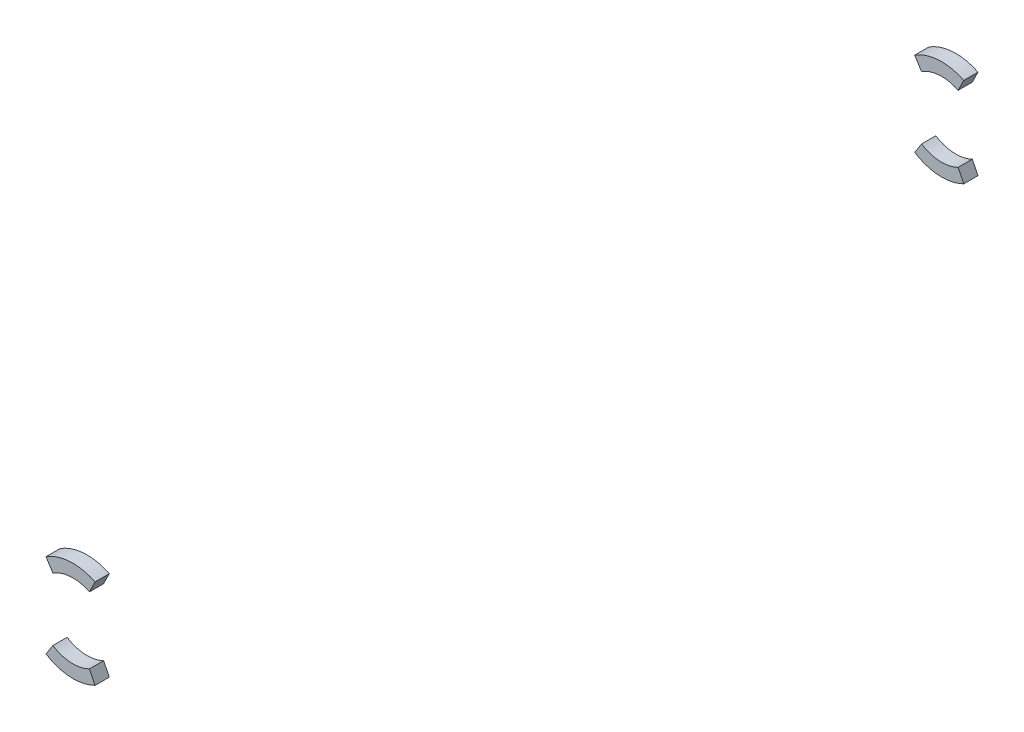
ISO-10303-21;
HEADER;
FILE_DESCRIPTION(('STEP AP214'),'2;1');
FILE_NAME('part.step','',(''),(''),'','','');
FILE_SCHEMA(('AUTOMOTIVE_DESIGN { 1 0 10303 214 1 1 1 1 }'));
ENDSEC;
DATA;
#1=APPLICATION_CONTEXT('core data for automotive mechanical design processes');
#2=APPLICATION_PROTOCOL_DEFINITION('international standard','automotive_design',2000,#1);
#3=PRODUCT_CONTEXT('',#1,'mechanical');
#4=PRODUCT('Part','Part','',(#3));
#5=PRODUCT_RELATED_PRODUCT_CATEGORY('part','',(#4));
#6=PRODUCT_DEFINITION_FORMATION('','',#4);
#7=PRODUCT_DEFINITION_CONTEXT('part definition',#1,'design');
#8=PRODUCT_DEFINITION('design','',#6,#7);
#9=PRODUCT_DEFINITION_SHAPE('','',#8);
#10=(LENGTH_UNIT() NAMED_UNIT(*) SI_UNIT(.MILLI.,.METRE.));
#11=(NAMED_UNIT(*) PLANE_ANGLE_UNIT() SI_UNIT($,.RADIAN.));
#12=(NAMED_UNIT(*) SI_UNIT($,.STERADIAN.) SOLID_ANGLE_UNIT());
#13=UNCERTAINTY_MEASURE_WITH_UNIT(LENGTH_MEASURE(1.E-05),#10,'distance_accuracy_value','');
#14=(GEOMETRIC_REPRESENTATION_CONTEXT(3) GLOBAL_UNCERTAINTY_ASSIGNED_CONTEXT((#13)) GLOBAL_UNIT_ASSIGNED_CONTEXT((#10,
#11,#12)) REPRESENTATION_CONTEXT('',''));
#15=CARTESIAN_POINT('',(0.,0.,0.));
#16=DIRECTION('',(0.,0.,1.));
#17=DIRECTION('',(1.,0.,0.));
#18=AXIS2_PLACEMENT_3D('',#15,#16,#17);
#19=CARTESIAN_POINT('',(0.,0.,1200.));
#20=DIRECTION('',(0.,0.,1.));
#21=DIRECTION('',(1.,0.,0.));
#22=AXIS2_PLACEMENT_3D('',#19,#20,#21);
#23=CYLINDRICAL_SURFACE('',#22,70.1988909444927);
#24=CARTESIAN_POINT('',(0.,0.,1220.));
#25=DIRECTION('',(0.,0.,1.));
#26=DIRECTION('',(1.,0.,0.));
#27=AXIS2_PLACEMENT_3D('',#24,#25,#26);
#28=CIRCLE('',#27,70.1988909444927);
#29=CARTESIAN_POINT('',(-37.8214558862849,-59.1390037494595,1220.));
#30=VERTEX_POINT('',#29);
#31=CARTESIAN_POINT('',(31.1075264082809,-62.9301683661731,1220.));
#32=VERTEX_POINT('',#31);
#33=EDGE_CURVE('E114',#30,#32,#28,.T.);
#34=ORIENTED_EDGE('',*,*,#33,.F.);
#35=DIRECTION('',(0.,0.,1.));
#36=VECTOR('',#35,1.);
#37=CARTESIAN_POINT('',(-37.8214558862849,-59.1390037494595,1200.));
#38=LINE('',#37,#36);
#39=CARTESIAN_POINT('',(-37.8214558862849,-59.1390037494595,1200.));
#40=VERTEX_POINT('',#39);
#41=EDGE_CURVE('E12',#40,#30,#38,.T.);
#42=ORIENTED_EDGE('',*,*,#41,.F.);
#43=CARTESIAN_POINT('',(0.,0.,1200.));
#44=DIRECTION('',(0.,0.,1.));
#45=DIRECTION('',(1.,0.,0.));
#46=AXIS2_PLACEMENT_3D('',#43,#44,#45);
#47=CIRCLE('',#46,70.1988909444927);
#48=CARTESIAN_POINT('',(31.1075264082809,-62.9301683661731,1200.));
#49=VERTEX_POINT('',#48);
#50=EDGE_CURVE('E108',#40,#49,#47,.T.);
#51=ORIENTED_EDGE('',*,*,#50,.T.);
#52=DIRECTION('',(0.,0.,1.));
#53=VECTOR('',#52,1.);
#54=CARTESIAN_POINT('',(31.1075264082809,-62.9301683661731,1200.));
#55=LINE('',#54,#53);
#56=EDGE_CURVE('E53',#49,#32,#55,.T.);
#57=ORIENTED_EDGE('',*,*,#56,.T.);
#58=EDGE_LOOP('',(#34,#42,#51,#57));
#59=FACE_BOUND('',#58,.T.);
#60=ADVANCED_FACE('F50',(#59),#23,.T.);
#61=CARTESIAN_POINT('',(-37.8214558862849,-59.1390037494595,1200.));
#62=DIRECTION('',(-0.842449260291328,0.538775689721237,0.));
#63=DIRECTION('',(-0.538775689721237,-0.842449260291328,0.));
#64=AXIS2_PLACEMENT_3D('',#61,#62,#63);
#65=PLANE('',#64);
#66=DIRECTION('',(-0.538775689721237,-0.842449260291328,0.));
#67=VECTOR('',#66,1.);
#68=CARTESIAN_POINT('',(-37.8214558862849,-59.1390037494595,1220.));
#69=LINE('',#68,#67);
#70=CARTESIAN_POINT('',(-28.1601263047385,-44.0321974946789,1220.));
#71=VERTEX_POINT('',#70);
#72=EDGE_CURVE('E110',#71,#30,#69,.T.);
#73=ORIENTED_EDGE('',*,*,#72,.F.);
#74=DIRECTION('',(0.,0.,1.));
#75=VECTOR('',#74,1.);
#76=CARTESIAN_POINT('',(-28.1601263047385,-44.0321974946789,1200.));
#77=LINE('',#76,#75);
#78=CARTESIAN_POINT('',(-28.1601263047385,-44.0321974946789,1200.));
#79=VERTEX_POINT('',#78);
#80=EDGE_CURVE('E59',#79,#71,#77,.T.);
#81=ORIENTED_EDGE('',*,*,#80,.F.);
#82=DIRECTION('',(-0.538775689721237,-0.842449260291328,0.));
#83=VECTOR('',#82,1.);
#84=CARTESIAN_POINT('',(-37.8214558862849,-59.1390037494595,1200.));
#85=LINE('',#84,#83);
#86=EDGE_CURVE('E105',#79,#40,#85,.T.);
#87=ORIENTED_EDGE('',*,*,#86,.T.);
#88=ORIENTED_EDGE('',*,*,#41,.T.);
#89=EDGE_LOOP('',(#73,#81,#87,#88));
#90=FACE_BOUND('',#89,.T.);
#91=ADVANCED_FACE('F124',(#90),#65,.T.);
#92=CARTESIAN_POINT('',(0.,0.,1200.));
#93=DIRECTION('',(0.,0.,1.));
#94=DIRECTION('',(1.,0.,0.));
#95=AXIS2_PLACEMENT_3D('',#92,#93,#94);
#96=CYLINDRICAL_SURFACE('',#95,52.2668836808665);
#97=CARTESIAN_POINT('',(0.,0.,1220.));
#98=DIRECTION('',(0.,0.,-1.));
#99=DIRECTION('',(1.,0.,0.));
#100=AXIS2_PLACEMENT_3D('',#97,#98,#99);
#101=CIRCLE('',#100,52.2668836808665);
#102=CARTESIAN_POINT('',(23.1612414741241,-46.8549252809834,1220.));
#103=VERTEX_POINT('',#102);
#104=EDGE_CURVE('E100',#103,#71,#101,.T.);
#105=ORIENTED_EDGE('',*,*,#104,.F.);
#106=DIRECTION('',(0.,0.,1.));
#107=VECTOR('',#106,1.);
#108=CARTESIAN_POINT('',(23.1612414741241,-46.8549252809834,1200.));
#109=LINE('',#108,#107);
#110=CARTESIAN_POINT('',(23.1612414741241,-46.8549252809834,1200.));
#111=VERTEX_POINT('',#110);
#112=EDGE_CURVE('E95',#111,#103,#109,.T.);
#113=ORIENTED_EDGE('',*,*,#112,.F.);
#114=CARTESIAN_POINT('',(0.,0.,1200.));
#115=DIRECTION('',(0.,0.,-1.));
#116=DIRECTION('',(1.,0.,0.));
#117=AXIS2_PLACEMENT_3D('',#114,#115,#116);
#118=CIRCLE('',#117,52.2668836808665);
#119=EDGE_CURVE('E98',#111,#79,#118,.T.);
#120=ORIENTED_EDGE('',*,*,#119,.T.);
#121=ORIENTED_EDGE('',*,*,#80,.T.);
#122=EDGE_LOOP('',(#105,#113,#120,#121));
#123=FACE_BOUND('',#122,.T.);
#124=ADVANCED_FACE('F97',(#123),#96,.F.);
#125=CARTESIAN_POINT('',(31.1075264082809,-62.9301683661731,1200.));
#126=DIRECTION('',(0.896455307476764,0.443134157673204,0.));
#127=DIRECTION('',(-0.443134157673204,0.896455307476764,0.));
#128=AXIS2_PLACEMENT_3D('',#125,#126,#127);
#129=PLANE('',#128);
#130=DIRECTION('',(-0.443134157673204,0.896455307476764,0.));
#131=VECTOR('',#130,1.);
#132=CARTESIAN_POINT('',(31.1075264082809,-62.9301683661731,1220.));
#133=LINE('',#132,#131);
#134=EDGE_CURVE('E117',#32,#103,#133,.T.);
#135=ORIENTED_EDGE('',*,*,#134,.F.);
#136=ORIENTED_EDGE('',*,*,#56,.F.);
#137=DIRECTION('',(-0.443134157673204,0.896455307476764,0.));
#138=VECTOR('',#137,1.);
#139=CARTESIAN_POINT('',(31.1075264082809,-62.9301683661731,1200.));
#140=LINE('',#139,#138);
#141=EDGE_CURVE('E104',#49,#111,#140,.T.);
#142=ORIENTED_EDGE('',*,*,#141,.T.);
#143=ORIENTED_EDGE('',*,*,#112,.T.);
#144=EDGE_LOOP('',(#135,#136,#142,#143));
#145=FACE_BOUND('',#144,.T.);
#146=ADVANCED_FACE('F107',(#145),#129,.T.);
#147=CARTESIAN_POINT('',(0.,0.,1200.));
#148=DIRECTION('',(0.,0.,1.));
#149=DIRECTION('',(1.,0.,0.));
#150=AXIS2_PLACEMENT_3D('',#147,#148,#149);
#151=PLANE('',#150);
#152=ORIENTED_EDGE('',*,*,#50,.F.);
#153=ORIENTED_EDGE('',*,*,#86,.F.);
#154=ORIENTED_EDGE('',*,*,#119,.F.);
#155=ORIENTED_EDGE('',*,*,#141,.F.);
#156=EDGE_LOOP('',(#152,#153,#154,#155));
#157=FACE_BOUND('',#156,.T.);
#158=ADVANCED_FACE('F103',(#157),#151,.F.);
#159=CARTESIAN_POINT('',(0.,0.,1220.));
#160=DIRECTION('',(0.,0.,1.));
#161=DIRECTION('',(1.,0.,0.));
#162=AXIS2_PLACEMENT_3D('',#159,#160,#161);
#163=PLANE('',#162);
#164=ORIENTED_EDGE('',*,*,#33,.T.);
#165=ORIENTED_EDGE('',*,*,#134,.T.);
#166=ORIENTED_EDGE('',*,*,#104,.T.);
#167=ORIENTED_EDGE('',*,*,#72,.T.);
#168=EDGE_LOOP('',(#164,#165,#166,#167));
#169=FACE_BOUND('',#168,.T.);
#170=ADVANCED_FACE('F123',(#169),#163,.T.);
#171=CLOSED_SHELL('',(#60,#91,#124,#146,#158,#170));
#172=MANIFOLD_SOLID_BREP('B2',#171);
#173=CARTESIAN_POINT('',(0.,0.,1200.));
#174=DIRECTION('',(0.,0.,1.));
#175=DIRECTION('',(1.,0.,0.));
#176=AXIS2_PLACEMENT_3D('',#173,#174,#175);
#177=CYLINDRICAL_SURFACE('',#176,70.1988909444927);
#178=CARTESIAN_POINT('',(0.,0.,1220.));
#179=DIRECTION('',(0.,0.,1.));
#180=DIRECTION('',(-1.,0.,0.));
#181=AXIS2_PLACEMENT_3D('',#178,#179,#180);
#182=CIRCLE('',#181,70.1988909444927);
#183=CARTESIAN_POINT('',(31.1075264082809,62.9301683661731,1220.));
#184=VERTEX_POINT('',#183);
#185=CARTESIAN_POINT('',(-37.8214558862849,59.1390037494595,1220.));
#186=VERTEX_POINT('',#185);
#187=EDGE_CURVE('E254',#184,#186,#182,.T.);
#188=ORIENTED_EDGE('',*,*,#187,.F.);
#189=DIRECTION('',(0.,0.,1.));
#190=VECTOR('',#189,1.);
#191=CARTESIAN_POINT('',(31.1075264082809,62.9301683661731,1200.));
#192=LINE('',#191,#190);
#193=CARTESIAN_POINT('',(31.1075264082809,62.9301683661731,1200.));
#194=VERTEX_POINT('',#193);
#195=EDGE_CURVE('E48',#194,#184,#192,.T.);
#196=ORIENTED_EDGE('',*,*,#195,.F.);
#197=CARTESIAN_POINT('',(0.,0.,1200.));
#198=DIRECTION('',(0.,0.,1.));
#199=DIRECTION('',(-1.,0.,0.));
#200=AXIS2_PLACEMENT_3D('',#197,#198,#199);
#201=CIRCLE('',#200,70.1988909444927);
#202=CARTESIAN_POINT('',(-37.8214558862849,59.1390037494595,1200.));
#203=VERTEX_POINT('',#202);
#204=EDGE_CURVE('E246',#194,#203,#201,.T.);
#205=ORIENTED_EDGE('',*,*,#204,.T.);
#206=DIRECTION('',(0.,0.,1.));
#207=VECTOR('',#206,1.);
#208=CARTESIAN_POINT('',(-37.8214558862849,59.1390037494595,1200.));
#209=LINE('',#208,#207);
#210=EDGE_CURVE('E187',#203,#186,#209,.T.);
#211=ORIENTED_EDGE('',*,*,#210,.T.);
#212=EDGE_LOOP('',(#188,#196,#205,#211));
#213=FACE_BOUND('',#212,.T.);
#214=ADVANCED_FACE('F184',(#213),#177,.T.);
#215=CARTESIAN_POINT('',(31.1075264082809,62.9301683661731,1200.));
#216=DIRECTION('',(0.896455307476764,-0.443134157673204,0.));
#217=DIRECTION('',(0.443134157673204,0.896455307476764,0.));
#218=AXIS2_PLACEMENT_3D('',#215,#216,#217);
#219=PLANE('',#218);
#220=DIRECTION('',(0.443134157673204,0.896455307476764,0.));
#221=VECTOR('',#220,1.);
#222=CARTESIAN_POINT('',(31.1075264082809,62.9301683661731,1220.));
#223=LINE('',#222,#221);
#224=CARTESIAN_POINT('',(23.1612414741241,46.8549252809834,1220.));
#225=VERTEX_POINT('',#224);
#226=EDGE_CURVE('E249',#225,#184,#223,.T.);
#227=ORIENTED_EDGE('',*,*,#226,.F.);
#228=DIRECTION('',(0.,0.,1.));
#229=VECTOR('',#228,1.);
#230=CARTESIAN_POINT('',(23.1612414741241,46.8549252809834,1200.));
#231=LINE('',#230,#229);
#232=CARTESIAN_POINT('',(23.1612414741241,46.8549252809834,1200.));
#233=VERTEX_POINT('',#232);
#234=EDGE_CURVE('E194',#233,#225,#231,.T.);
#235=ORIENTED_EDGE('',*,*,#234,.F.);
#236=DIRECTION('',(0.443134157673204,0.896455307476764,0.));
#237=VECTOR('',#236,1.);
#238=CARTESIAN_POINT('',(31.1075264082809,62.9301683661731,1200.));
#239=LINE('',#238,#237);
#240=EDGE_CURVE('E241',#233,#194,#239,.T.);
#241=ORIENTED_EDGE('',*,*,#240,.T.);
#242=ORIENTED_EDGE('',*,*,#195,.T.);
#243=EDGE_LOOP('',(#227,#235,#241,#242));
#244=FACE_BOUND('',#243,.T.);
#245=ADVANCED_FACE('F270',(#244),#219,.T.);
#246=CARTESIAN_POINT('',(0.,0.,1200.));
#247=DIRECTION('',(0.,0.,1.));
#248=DIRECTION('',(1.,0.,0.));
#249=AXIS2_PLACEMENT_3D('',#246,#247,#248);
#250=CYLINDRICAL_SURFACE('',#249,52.2668836808665);
#251=CARTESIAN_POINT('',(0.,0.,1220.));
#252=DIRECTION('',(0.,0.,-1.));
#253=DIRECTION('',(-1.,0.,0.));
#254=AXIS2_PLACEMENT_3D('',#251,#252,#253);
#255=CIRCLE('',#254,52.2668836808665);
#256=CARTESIAN_POINT('',(-28.1601263047385,44.0321974946789,1220.));
#257=VERTEX_POINT('',#256);
#258=EDGE_CURVE('E235',#257,#225,#255,.T.);
#259=ORIENTED_EDGE('',*,*,#258,.F.);
#260=DIRECTION('',(0.,0.,1.));
#261=VECTOR('',#260,1.);
#262=CARTESIAN_POINT('',(-28.1601263047385,44.0321974946789,1200.));
#263=LINE('',#262,#261);
#264=CARTESIAN_POINT('',(-28.1601263047385,44.0321974946789,1200.));
#265=VERTEX_POINT('',#264);
#266=EDGE_CURVE('E230',#265,#257,#263,.T.);
#267=ORIENTED_EDGE('',*,*,#266,.F.);
#268=CARTESIAN_POINT('',(0.,0.,1200.));
#269=DIRECTION('',(0.,0.,-1.));
#270=DIRECTION('',(-1.,0.,0.));
#271=AXIS2_PLACEMENT_3D('',#268,#269,#270);
#272=CIRCLE('',#271,52.2668836808665);
#273=EDGE_CURVE('E233',#265,#233,#272,.T.);
#274=ORIENTED_EDGE('',*,*,#273,.T.);
#275=ORIENTED_EDGE('',*,*,#234,.T.);
#276=EDGE_LOOP('',(#259,#267,#274,#275));
#277=FACE_BOUND('',#276,.T.);
#278=ADVANCED_FACE('F232',(#277),#250,.F.);
#279=CARTESIAN_POINT('',(-37.8214558862849,59.1390037494595,1200.));
#280=DIRECTION('',(-0.842449260291328,-0.538775689721237,0.));
#281=DIRECTION('',(0.538775689721237,-0.842449260291328,0.));
#282=AXIS2_PLACEMENT_3D('',#279,#280,#281);
#283=PLANE('',#282);
#284=DIRECTION('',(0.538775689721237,-0.842449260291328,0.));
#285=VECTOR('',#284,1.);
#286=CARTESIAN_POINT('',(-37.8214558862849,59.1390037494595,1220.));
#287=LINE('',#286,#285);
#288=EDGE_CURVE('E258',#186,#257,#287,.T.);
#289=ORIENTED_EDGE('',*,*,#288,.F.);
#290=ORIENTED_EDGE('',*,*,#210,.F.);
#291=DIRECTION('',(0.538775689721237,-0.842449260291328,0.));
#292=VECTOR('',#291,1.);
#293=CARTESIAN_POINT('',(-37.8214558862849,59.1390037494595,1200.));
#294=LINE('',#293,#292);
#295=EDGE_CURVE('E240',#203,#265,#294,.T.);
#296=ORIENTED_EDGE('',*,*,#295,.T.);
#297=ORIENTED_EDGE('',*,*,#266,.T.);
#298=EDGE_LOOP('',(#289,#290,#296,#297));
#299=FACE_BOUND('',#298,.T.);
#300=ADVANCED_FACE('F244',(#299),#283,.T.);
#301=CARTESIAN_POINT('',(0.,0.,1200.));
#302=DIRECTION('',(0.,0.,-1.));
#303=DIRECTION('',(-1.,0.,0.));
#304=AXIS2_PLACEMENT_3D('',#301,#302,#303);
#305=PLANE('',#304);
#306=ORIENTED_EDGE('',*,*,#204,.F.);
#307=ORIENTED_EDGE('',*,*,#240,.F.);
#308=ORIENTED_EDGE('',*,*,#273,.F.);
#309=ORIENTED_EDGE('',*,*,#295,.F.);
#310=EDGE_LOOP('',(#306,#307,#308,#309));
#311=FACE_BOUND('',#310,.T.);
#312=ADVANCED_FACE('F239',(#311),#305,.T.);
#313=CARTESIAN_POINT('',(0.,0.,1220.));
#314=DIRECTION('',(0.,0.,-1.));
#315=DIRECTION('',(-1.,0.,0.));
#316=AXIS2_PLACEMENT_3D('',#313,#314,#315);
#317=PLANE('',#316);
#318=ORIENTED_EDGE('',*,*,#187,.T.);
#319=ORIENTED_EDGE('',*,*,#288,.T.);
#320=ORIENTED_EDGE('',*,*,#258,.T.);
#321=ORIENTED_EDGE('',*,*,#226,.T.);
#322=EDGE_LOOP('',(#318,#319,#320,#321));
#323=FACE_BOUND('',#322,.T.);
#324=ADVANCED_FACE('F269',(#323),#317,.F.);
#325=CLOSED_SHELL('',(#214,#245,#278,#300,#312,#324));
#326=MANIFOLD_SOLID_BREP('B6',#325);
#327=CARTESIAN_POINT('',(0.,0.,-20.));
#328=DIRECTION('',(0.,0.,1.));
#329=DIRECTION('',(1.,0.,0.));
#330=AXIS2_PLACEMENT_3D('',#327,#328,#329);
#331=CYLINDRICAL_SURFACE('',#330,70.1988909444927);
#332=CARTESIAN_POINT('',(0.,0.,0.));
#333=DIRECTION('',(0.,0.,1.));
#334=DIRECTION('',(1.,0.,0.));
#335=AXIS2_PLACEMENT_3D('',#332,#333,#334);
#336=CIRCLE('',#335,70.1988909444927);
#337=CARTESIAN_POINT('',(-37.8214558862849,-59.1390037494595,0.));
#338=VERTEX_POINT('',#337);
#339=CARTESIAN_POINT('',(31.1075264082809,-62.9301683661731,0.));
#340=VERTEX_POINT('',#339);
#341=EDGE_CURVE('E393',#338,#340,#336,.T.);
#342=ORIENTED_EDGE('',*,*,#341,.F.);
#343=DIRECTION('',(0.,0.,1.));
#344=VECTOR('',#343,1.);
#345=CARTESIAN_POINT('',(-37.8214558862849,-59.1390037494595,-20.));
#346=LINE('',#345,#344);
#347=CARTESIAN_POINT('',(-37.8214558862849,-59.1390037494595,-20.));
#348=VERTEX_POINT('',#347);
#349=EDGE_CURVE('E182',#348,#338,#346,.T.);
#350=ORIENTED_EDGE('',*,*,#349,.F.);
#351=CARTESIAN_POINT('',(0.,0.,-20.));
#352=DIRECTION('',(0.,0.,1.));
#353=DIRECTION('',(1.,0.,0.));
#354=AXIS2_PLACEMENT_3D('',#351,#352,#353);
#355=CIRCLE('',#354,70.1988909444927);
#356=CARTESIAN_POINT('',(31.1075264082809,-62.9301683661731,-20.));
#357=VERTEX_POINT('',#356);
#358=EDGE_CURVE('E387',#348,#357,#355,.T.);
#359=ORIENTED_EDGE('',*,*,#358,.T.);
#360=DIRECTION('',(0.,0.,1.));
#361=VECTOR('',#360,1.);
#362=CARTESIAN_POINT('',(31.1075264082809,-62.9301683661731,-20.));
#363=LINE('',#362,#361);
#364=EDGE_CURVE('E332',#357,#340,#363,.T.);
#365=ORIENTED_EDGE('',*,*,#364,.T.);
#366=EDGE_LOOP('',(#342,#350,#359,#365));
#367=FACE_BOUND('',#366,.T.);
#368=ADVANCED_FACE('F329',(#367),#331,.T.);
#369=CARTESIAN_POINT('',(-37.8214558862849,-59.1390037494595,-20.));
#370=DIRECTION('',(-0.842449260291328,0.538775689721237,0.));
#371=DIRECTION('',(-0.538775689721237,-0.842449260291328,0.));
#372=AXIS2_PLACEMENT_3D('',#369,#370,#371);
#373=PLANE('',#372);
#374=DIRECTION('',(-0.538775689721237,-0.842449260291328,0.));
#375=VECTOR('',#374,1.);
#376=CARTESIAN_POINT('',(-37.8214558862849,-59.1390037494595,0.));
#377=LINE('',#376,#375);
#378=CARTESIAN_POINT('',(-28.1601263047385,-44.0321974946789,0.));
#379=VERTEX_POINT('',#378);
#380=EDGE_CURVE('E389',#379,#338,#377,.T.);
#381=ORIENTED_EDGE('',*,*,#380,.F.);
#382=DIRECTION('',(0.,0.,1.));
#383=VECTOR('',#382,1.);
#384=CARTESIAN_POINT('',(-28.1601263047385,-44.0321974946789,-20.));
#385=LINE('',#384,#383);
#386=CARTESIAN_POINT('',(-28.1601263047385,-44.0321974946789,-20.));
#387=VERTEX_POINT('',#386);
#388=EDGE_CURVE('E338',#387,#379,#385,.T.);
#389=ORIENTED_EDGE('',*,*,#388,.F.);
#390=DIRECTION('',(-0.538775689721237,-0.842449260291328,0.));
#391=VECTOR('',#390,1.);
#392=CARTESIAN_POINT('',(-37.8214558862849,-59.1390037494595,-20.));
#393=LINE('',#392,#391);
#394=EDGE_CURVE('E384',#387,#348,#393,.T.);
#395=ORIENTED_EDGE('',*,*,#394,.T.);
#396=ORIENTED_EDGE('',*,*,#349,.T.);
#397=EDGE_LOOP('',(#381,#389,#395,#396));
#398=FACE_BOUND('',#397,.T.);
#399=ADVANCED_FACE('F403',(#398),#373,.T.);
#400=CARTESIAN_POINT('',(0.,0.,-20.));
#401=DIRECTION('',(0.,0.,1.));
#402=DIRECTION('',(1.,0.,0.));
#403=AXIS2_PLACEMENT_3D('',#400,#401,#402);
#404=CYLINDRICAL_SURFACE('',#403,52.2668836808665);
#405=CARTESIAN_POINT('',(0.,0.,0.));
#406=DIRECTION('',(0.,0.,-1.));
#407=DIRECTION('',(1.,0.,0.));
#408=AXIS2_PLACEMENT_3D('',#405,#406,#407);
#409=CIRCLE('',#408,52.2668836808665);
#410=CARTESIAN_POINT('',(23.1612414741241,-46.8549252809834,0.));
#411=VERTEX_POINT('',#410);
#412=EDGE_CURVE('E379',#411,#379,#409,.T.);
#413=ORIENTED_EDGE('',*,*,#412,.F.);
#414=DIRECTION('',(0.,0.,1.));
#415=VECTOR('',#414,1.);
#416=CARTESIAN_POINT('',(23.1612414741241,-46.8549252809834,-20.));
#417=LINE('',#416,#415);
#418=CARTESIAN_POINT('',(23.1612414741241,-46.8549252809834,-20.));
#419=VERTEX_POINT('',#418);
#420=EDGE_CURVE('E374',#419,#411,#417,.T.);
#421=ORIENTED_EDGE('',*,*,#420,.F.);
#422=CARTESIAN_POINT('',(0.,0.,-20.));
#423=DIRECTION('',(0.,0.,-1.));
#424=DIRECTION('',(1.,0.,0.));
#425=AXIS2_PLACEMENT_3D('',#422,#423,#424);
#426=CIRCLE('',#425,52.2668836808665);
#427=EDGE_CURVE('E377',#419,#387,#426,.T.);
#428=ORIENTED_EDGE('',*,*,#427,.T.);
#429=ORIENTED_EDGE('',*,*,#388,.T.);
#430=EDGE_LOOP('',(#413,#421,#428,#429));
#431=FACE_BOUND('',#430,.T.);
#432=ADVANCED_FACE('F376',(#431),#404,.F.);
#433=CARTESIAN_POINT('',(31.1075264082809,-62.9301683661731,-20.));
#434=DIRECTION('',(0.896455307476764,0.443134157673204,0.));
#435=DIRECTION('',(-0.443134157673204,0.896455307476764,0.));
#436=AXIS2_PLACEMENT_3D('',#433,#434,#435);
#437=PLANE('',#436);
#438=DIRECTION('',(-0.443134157673204,0.896455307476764,0.));
#439=VECTOR('',#438,1.);
#440=CARTESIAN_POINT('',(31.1075264082809,-62.9301683661731,0.));
#441=LINE('',#440,#439);
#442=EDGE_CURVE('E396',#340,#411,#441,.T.);
#443=ORIENTED_EDGE('',*,*,#442,.F.);
#444=ORIENTED_EDGE('',*,*,#364,.F.);
#445=DIRECTION('',(-0.443134157673204,0.896455307476764,0.));
#446=VECTOR('',#445,1.);
#447=CARTESIAN_POINT('',(31.1075264082809,-62.9301683661731,-20.));
#448=LINE('',#447,#446);
#449=EDGE_CURVE('E383',#357,#419,#448,.T.);
#450=ORIENTED_EDGE('',*,*,#449,.T.);
#451=ORIENTED_EDGE('',*,*,#420,.T.);
#452=EDGE_LOOP('',(#443,#444,#450,#451));
#453=FACE_BOUND('',#452,.T.);
#454=ADVANCED_FACE('F386',(#453),#437,.T.);
#455=CARTESIAN_POINT('',(0.,0.,-20.));
#456=DIRECTION('',(0.,0.,1.));
#457=DIRECTION('',(1.,0.,0.));
#458=AXIS2_PLACEMENT_3D('',#455,#456,#457);
#459=PLANE('',#458);
#460=ORIENTED_EDGE('',*,*,#358,.F.);
#461=ORIENTED_EDGE('',*,*,#394,.F.);
#462=ORIENTED_EDGE('',*,*,#427,.F.);
#463=ORIENTED_EDGE('',*,*,#449,.F.);
#464=EDGE_LOOP('',(#460,#461,#462,#463));
#465=FACE_BOUND('',#464,.T.);
#466=ADVANCED_FACE('F382',(#465),#459,.F.);
#467=CARTESIAN_POINT('',(0.,0.,0.));
#468=DIRECTION('',(0.,0.,1.));
#469=DIRECTION('',(1.,0.,0.));
#470=AXIS2_PLACEMENT_3D('',#467,#468,#469);
#471=PLANE('',#470);
#472=ORIENTED_EDGE('',*,*,#341,.T.);
#473=ORIENTED_EDGE('',*,*,#442,.T.);
#474=ORIENTED_EDGE('',*,*,#412,.T.);
#475=ORIENTED_EDGE('',*,*,#380,.T.);
#476=EDGE_LOOP('',(#472,#473,#474,#475));
#477=FACE_BOUND('',#476,.T.);
#478=ADVANCED_FACE('F402',(#477),#471,.T.);
#479=CLOSED_SHELL('',(#368,#399,#432,#454,#466,#478));
#480=MANIFOLD_SOLID_BREP('B42',#479);
#481=CARTESIAN_POINT('',(0.,0.,-20.));
#482=DIRECTION('',(0.,0.,1.));
#483=DIRECTION('',(1.,0.,0.));
#484=AXIS2_PLACEMENT_3D('',#481,#482,#483);
#485=CYLINDRICAL_SURFACE('',#484,70.1988909444927);
#486=CARTESIAN_POINT('',(0.,0.,0.));
#487=DIRECTION('',(0.,0.,1.));
#488=DIRECTION('',(-1.,0.,0.));
#489=AXIS2_PLACEMENT_3D('',#486,#487,#488);
#490=CIRCLE('',#489,70.1988909444927);
#491=CARTESIAN_POINT('',(31.1075264082809,62.9301683661731,0.));
#492=VERTEX_POINT('',#491);
#493=CARTESIAN_POINT('',(-37.8214558862849,59.1390037494595,0.));
#494=VERTEX_POINT('',#493);
#495=EDGE_CURVE('E517',#492,#494,#490,.T.);
#496=ORIENTED_EDGE('',*,*,#495,.F.);
#497=DIRECTION('',(0.,0.,1.));
#498=VECTOR('',#497,1.);
#499=CARTESIAN_POINT('',(31.1075264082809,62.9301683661731,-20.));
#500=LINE('',#499,#498);
#501=CARTESIAN_POINT('',(31.1075264082809,62.9301683661731,-20.));
#502=VERTEX_POINT('',#501);
#503=EDGE_CURVE('E327',#502,#492,#500,.T.);
#504=ORIENTED_EDGE('',*,*,#503,.F.);
#505=CARTESIAN_POINT('',(0.,0.,-20.));
#506=DIRECTION('',(0.,0.,1.));
#507=DIRECTION('',(-1.,0.,0.));
#508=AXIS2_PLACEMENT_3D('',#505,#506,#507);
#509=CIRCLE('',#508,70.1988909444927);
#510=CARTESIAN_POINT('',(-37.8214558862849,59.1390037494595,-20.));
#511=VERTEX_POINT('',#510);
#512=EDGE_CURVE('E511',#502,#511,#509,.T.);
#513=ORIENTED_EDGE('',*,*,#512,.T.);
#514=DIRECTION('',(0.,0.,1.));
#515=VECTOR('',#514,1.);
#516=CARTESIAN_POINT('',(-37.8214558862849,59.1390037494595,-20.));
#517=LINE('',#516,#515);
#518=EDGE_CURVE('E456',#511,#494,#517,.T.);
#519=ORIENTED_EDGE('',*,*,#518,.T.);
#520=EDGE_LOOP('',(#496,#504,#513,#519));
#521=FACE_BOUND('',#520,.T.);
#522=ADVANCED_FACE('F453',(#521),#485,.T.);
#523=CARTESIAN_POINT('',(31.1075264082809,62.9301683661731,-20.));
#524=DIRECTION('',(0.896455307476764,-0.443134157673204,0.));
#525=DIRECTION('',(0.443134157673204,0.896455307476764,0.));
#526=AXIS2_PLACEMENT_3D('',#523,#524,#525);
#527=PLANE('',#526);
#528=DIRECTION('',(0.443134157673204,0.896455307476764,0.));
#529=VECTOR('',#528,1.);
#530=CARTESIAN_POINT('',(31.1075264082809,62.9301683661731,0.));
#531=LINE('',#530,#529);
#532=CARTESIAN_POINT('',(23.1612414741241,46.8549252809834,0.));
#533=VERTEX_POINT('',#532);
#534=EDGE_CURVE('E513',#533,#492,#531,.T.);
#535=ORIENTED_EDGE('',*,*,#534,.F.);
#536=DIRECTION('',(0.,0.,1.));
#537=VECTOR('',#536,1.);
#538=CARTESIAN_POINT('',(23.1612414741241,46.8549252809834,-20.));
#539=LINE('',#538,#537);
#540=CARTESIAN_POINT('',(23.1612414741241,46.8549252809834,-20.));
#541=VERTEX_POINT('',#540);
#542=EDGE_CURVE('E462',#541,#533,#539,.T.);
#543=ORIENTED_EDGE('',*,*,#542,.F.);
#544=DIRECTION('',(0.443134157673204,0.896455307476764,0.));
#545=VECTOR('',#544,1.);
#546=CARTESIAN_POINT('',(31.1075264082809,62.9301683661731,-20.));
#547=LINE('',#546,#545);
#548=EDGE_CURVE('E508',#541,#502,#547,.T.);
#549=ORIENTED_EDGE('',*,*,#548,.T.);
#550=ORIENTED_EDGE('',*,*,#503,.T.);
#551=EDGE_LOOP('',(#535,#543,#549,#550));
#552=FACE_BOUND('',#551,.T.);
#553=ADVANCED_FACE('F527',(#552),#527,.T.);
#554=CARTESIAN_POINT('',(0.,0.,-20.));
#555=DIRECTION('',(0.,0.,1.));
#556=DIRECTION('',(1.,0.,0.));
#557=AXIS2_PLACEMENT_3D('',#554,#555,#556);
#558=CYLINDRICAL_SURFACE('',#557,52.2668836808665);
#559=CARTESIAN_POINT('',(0.,0.,0.));
#560=DIRECTION('',(0.,0.,-1.));
#561=DIRECTION('',(-1.,0.,0.));
#562=AXIS2_PLACEMENT_3D('',#559,#560,#561);
#563=CIRCLE('',#562,52.2668836808665);
#564=CARTESIAN_POINT('',(-28.1601263047385,44.0321974946789,0.));
#565=VERTEX_POINT('',#564);
#566=EDGE_CURVE('E503',#565,#533,#563,.T.);
#567=ORIENTED_EDGE('',*,*,#566,.F.);
#568=DIRECTION('',(0.,0.,1.));
#569=VECTOR('',#568,1.);
#570=CARTESIAN_POINT('',(-28.1601263047385,44.0321974946789,-20.));
#571=LINE('',#570,#569);
#572=CARTESIAN_POINT('',(-28.1601263047385,44.0321974946789,-20.));
#573=VERTEX_POINT('',#572);
#574=EDGE_CURVE('E498',#573,#565,#571,.T.);
#575=ORIENTED_EDGE('',*,*,#574,.F.);
#576=CARTESIAN_POINT('',(0.,0.,-20.));
#577=DIRECTION('',(0.,0.,-1.));
#578=DIRECTION('',(-1.,0.,0.));
#579=AXIS2_PLACEMENT_3D('',#576,#577,#578);
#580=CIRCLE('',#579,52.2668836808665);
#581=EDGE_CURVE('E501',#573,#541,#580,.T.);
#582=ORIENTED_EDGE('',*,*,#581,.T.);
#583=ORIENTED_EDGE('',*,*,#542,.T.);
#584=EDGE_LOOP('',(#567,#575,#582,#583));
#585=FACE_BOUND('',#584,.T.);
#586=ADVANCED_FACE('F500',(#585),#558,.F.);
#587=CARTESIAN_POINT('',(-37.8214558862849,59.1390037494595,-20.));
#588=DIRECTION('',(-0.842449260291328,-0.538775689721237,0.));
#589=DIRECTION('',(0.538775689721237,-0.842449260291328,0.));
#590=AXIS2_PLACEMENT_3D('',#587,#588,#589);
#591=PLANE('',#590);
#592=DIRECTION('',(0.538775689721237,-0.842449260291328,0.));
#593=VECTOR('',#592,1.);
#594=CARTESIAN_POINT('',(-37.8214558862849,59.1390037494595,0.));
#595=LINE('',#594,#593);
#596=EDGE_CURVE('E520',#494,#565,#595,.T.);
#597=ORIENTED_EDGE('',*,*,#596,.F.);
#598=ORIENTED_EDGE('',*,*,#518,.F.);
#599=DIRECTION('',(0.538775689721237,-0.842449260291328,0.));
#600=VECTOR('',#599,1.);
#601=CARTESIAN_POINT('',(-37.8214558862849,59.1390037494595,-20.));
#602=LINE('',#601,#600);
#603=EDGE_CURVE('E507',#511,#573,#602,.T.);
#604=ORIENTED_EDGE('',*,*,#603,.T.);
#605=ORIENTED_EDGE('',*,*,#574,.T.);
#606=EDGE_LOOP('',(#597,#598,#604,#605));
#607=FACE_BOUND('',#606,.T.);
#608=ADVANCED_FACE('F510',(#607),#591,.T.);
#609=CARTESIAN_POINT('',(0.,0.,-20.));
#610=DIRECTION('',(0.,0.,-1.));
#611=DIRECTION('',(-1.,0.,0.));
#612=AXIS2_PLACEMENT_3D('',#609,#610,#611);
#613=PLANE('',#612);
#614=ORIENTED_EDGE('',*,*,#512,.F.);
#615=ORIENTED_EDGE('',*,*,#548,.F.);
#616=ORIENTED_EDGE('',*,*,#581,.F.);
#617=ORIENTED_EDGE('',*,*,#603,.F.);
#618=EDGE_LOOP('',(#614,#615,#616,#617));
#619=FACE_BOUND('',#618,.T.);
#620=ADVANCED_FACE('F506',(#619),#613,.T.);
#621=CARTESIAN_POINT('',(0.,0.,0.));
#622=DIRECTION('',(0.,0.,-1.));
#623=DIRECTION('',(-1.,0.,0.));
#624=AXIS2_PLACEMENT_3D('',#621,#622,#623);
#625=PLANE('',#624);
#626=ORIENTED_EDGE('',*,*,#495,.T.);
#627=ORIENTED_EDGE('',*,*,#596,.T.);
#628=ORIENTED_EDGE('',*,*,#566,.T.);
#629=ORIENTED_EDGE('',*,*,#534,.T.);
#630=EDGE_LOOP('',(#626,#627,#628,#629));
#631=FACE_BOUND('',#630,.T.);
#632=ADVANCED_FACE('F526',(#631),#625,.F.);
#633=CLOSED_SHELL('',(#522,#553,#586,#608,#620,#632));
#634=MANIFOLD_SOLID_BREP('B176',#633);
#635=ADVANCED_BREP_SHAPE_REPRESENTATION('',(#18,#172,#326,#480,#634),#14);
#636=SHAPE_DEFINITION_REPRESENTATION(#9,#635);
ENDSEC;
END-ISO-10303-21;
